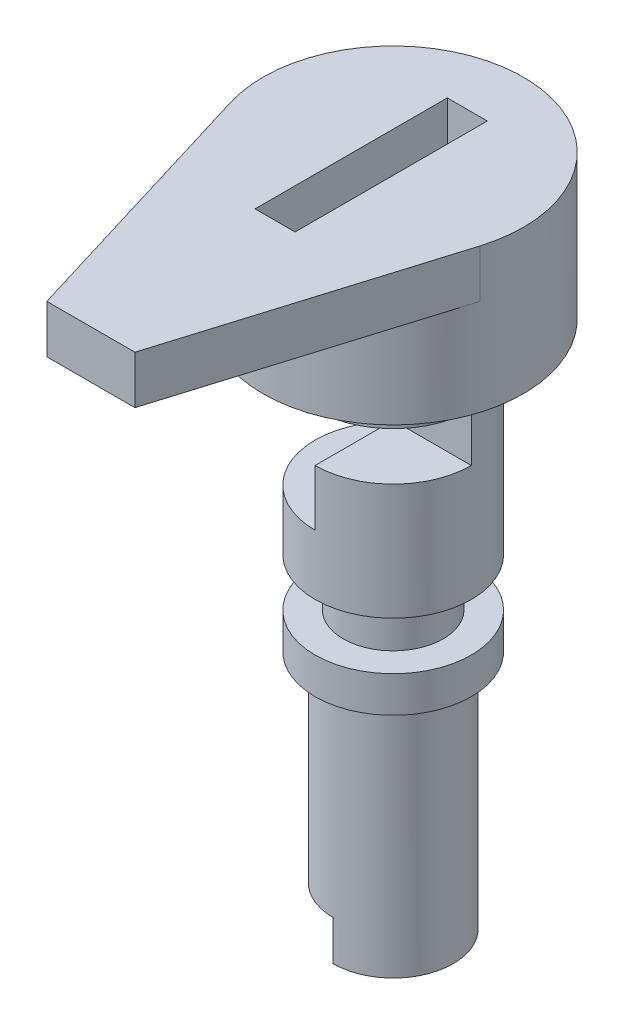
ISO-10303-21;
HEADER;
FILE_DESCRIPTION(('STEP AP214'),'2;1');
FILE_NAME('part.step','',(''),(''),'','','');
FILE_SCHEMA(('AUTOMOTIVE_DESIGN { 1 0 10303 214 1 1 1 1 }'));
ENDSEC;
DATA;
#1=APPLICATION_CONTEXT('core data for automotive mechanical design processes');
#2=APPLICATION_PROTOCOL_DEFINITION('international standard','automotive_design',2000,#1);
#3=PRODUCT_CONTEXT('',#1,'mechanical');
#4=PRODUCT('Part','Part','',(#3));
#5=PRODUCT_RELATED_PRODUCT_CATEGORY('part','',(#4));
#6=PRODUCT_DEFINITION_FORMATION('','',#4);
#7=PRODUCT_DEFINITION_CONTEXT('part definition',#1,'design');
#8=PRODUCT_DEFINITION('design','',#6,#7);
#9=PRODUCT_DEFINITION_SHAPE('','',#8);
#10=(LENGTH_UNIT() NAMED_UNIT(*) SI_UNIT(.MILLI.,.METRE.));
#11=(NAMED_UNIT(*) PLANE_ANGLE_UNIT() SI_UNIT($,.RADIAN.));
#12=(NAMED_UNIT(*) SI_UNIT($,.STERADIAN.) SOLID_ANGLE_UNIT());
#13=UNCERTAINTY_MEASURE_WITH_UNIT(LENGTH_MEASURE(1.E-05),#10,'distance_accuracy_value','');
#14=(GEOMETRIC_REPRESENTATION_CONTEXT(3) GLOBAL_UNCERTAINTY_ASSIGNED_CONTEXT((#13)) GLOBAL_UNIT_ASSIGNED_CONTEXT((#10,
#11,#12)) REPRESENTATION_CONTEXT('',''));
#15=CARTESIAN_POINT('',(0.,0.,0.));
#16=DIRECTION('',(0.,0.,1.));
#17=DIRECTION('',(1.,0.,0.));
#18=AXIS2_PLACEMENT_3D('',#15,#16,#17);
#19=CARTESIAN_POINT('',(0.,-13.2,0.));
#20=DIRECTION('',(0.,1.,0.));
#21=DIRECTION('',(0.,0.,1.));
#22=AXIS2_PLACEMENT_3D('',#19,#20,#21);
#23=CYLINDRICAL_SURFACE('',#22,1.5);
#24=CARTESIAN_POINT('',(0.,-7.2,0.));
#25=DIRECTION('',(0.,-1.,0.));
#26=DIRECTION('',(0.,0.,-1.));
#27=AXIS2_PLACEMENT_3D('',#24,#25,#26);
#28=CIRCLE('',#27,1.5);
#29=CARTESIAN_POINT('',(0.,-7.2,-1.5));
#30=VERTEX_POINT('',#29);
#31=EDGE_CURVE('E11',#30,#30,#28,.T.);
#32=ORIENTED_EDGE('',*,*,#31,.T.);
#33=EDGE_LOOP('',(#32));
#34=FACE_BOUND('',#33,.T.);
#35=DIRECTION('',(0.,-1.,0.));
#36=VECTOR('',#35,1.);
#37=CARTESIAN_POINT('',(0.,-12.2,-1.5));
#38=LINE('',#37,#36);
#39=CARTESIAN_POINT('',(0.,-12.2,-1.5));
#40=VERTEX_POINT('',#39);
#41=CARTESIAN_POINT('',(0.,-13.2,-1.5));
#42=VERTEX_POINT('',#41);
#43=EDGE_CURVE('E185',#40,#42,#38,.T.);
#44=ORIENTED_EDGE('',*,*,#43,.F.);
#45=CARTESIAN_POINT('',(0.,-12.2,0.));
#46=DIRECTION('',(0.,1.,0.));
#47=DIRECTION('',(0.,0.,1.));
#48=AXIS2_PLACEMENT_3D('',#45,#46,#47);
#49=CIRCLE('',#48,1.5);
#50=CARTESIAN_POINT('',(0.,-12.2,1.5));
#51=VERTEX_POINT('',#50);
#52=EDGE_CURVE('E192',#40,#51,#49,.T.);
#53=ORIENTED_EDGE('',*,*,#52,.T.);
#54=DIRECTION('',(0.,-1.,0.));
#55=VECTOR('',#54,1.);
#56=CARTESIAN_POINT('',(0.,-12.2,1.5));
#57=LINE('',#56,#55);
#58=CARTESIAN_POINT('',(0.,-13.2,1.5));
#59=VERTEX_POINT('',#58);
#60=EDGE_CURVE('E175',#51,#59,#57,.T.);
#61=ORIENTED_EDGE('',*,*,#60,.T.);
#62=CARTESIAN_POINT('',(0.,-13.2,0.));
#63=DIRECTION('',(0.,-1.,0.));
#64=DIRECTION('',(0.,0.,-1.));
#65=AXIS2_PLACEMENT_3D('',#62,#63,#64);
#66=CIRCLE('',#65,1.5);
#67=EDGE_CURVE('E225',#42,#59,#66,.T.);
#68=ORIENTED_EDGE('',*,*,#67,.F.);
#69=EDGE_LOOP('',(#44,#53,#61,#68));
#70=FACE_BOUND('',#69,.T.);
#71=ADVANCED_FACE('F32',(#34,#70),#23,.T.);
#72=CARTESIAN_POINT('',(0.,-13.2,0.));
#73=DIRECTION('',(0.,-1.,0.));
#74=DIRECTION('',(0.,0.,-1.));
#75=AXIS2_PLACEMENT_3D('',#72,#73,#74);
#76=PLANE('',#75);
#77=CARTESIAN_POINT('',(0.,-13.2,0.));
#78=DIRECTION('',(0.,1.,0.));
#79=DIRECTION('',(0.,0.,1.));
#80=AXIS2_PLACEMENT_3D('',#77,#78,#79);
#81=CIRCLE('',#80,0.01);
#82=CARTESIAN_POINT('',(0.,-13.2,-0.01));
#83=VERTEX_POINT('',#82);
#84=CARTESIAN_POINT('',(0.,-13.2,0.01));
#85=VERTEX_POINT('',#84);
#86=EDGE_CURVE('E195',#83,#85,#81,.T.);
#87=ORIENTED_EDGE('',*,*,#86,.F.);
#88=DIRECTION('',(0.,0.,1.));
#89=VECTOR('',#88,1.);
#90=CARTESIAN_POINT('',(0.,-13.2,-1.5));
#91=LINE('',#90,#89);
#92=EDGE_CURVE('E187',#42,#83,#91,.T.);
#93=ORIENTED_EDGE('',*,*,#92,.F.);
#94=ORIENTED_EDGE('',*,*,#67,.T.);
#95=DIRECTION('',(0.,0.,-1.));
#96=VECTOR('',#95,1.);
#97=CARTESIAN_POINT('',(0.,-13.2,1.5));
#98=LINE('',#97,#96);
#99=EDGE_CURVE('E181',#59,#85,#98,.T.);
#100=ORIENTED_EDGE('',*,*,#99,.T.);
#101=EDGE_LOOP('',(#87,#93,#94,#100));
#102=FACE_BOUND('',#101,.T.);
#103=ADVANCED_FACE('F310',(#102),#76,.T.);
#104=CARTESIAN_POINT('',(0.,2.4,0.));
#105=DIRECTION('',(0.,-1.,0.));
#106=DIRECTION('',(0.,0.,-1.));
#107=AXIS2_PLACEMENT_3D('',#104,#105,#106);
#108=CYLINDRICAL_SURFACE('',#107,3.25);
#109=CARTESIAN_POINT('',(0.,2.4,0.));
#110=DIRECTION('',(0.,1.,0.));
#111=DIRECTION('',(0.,0.,1.));
#112=AXIS2_PLACEMENT_3D('',#109,#110,#111);
#113=CIRCLE('',#112,3.25);
#114=CARTESIAN_POINT('',(-3.10927392322903,2.4,0.94599982575471));
#115=VERTEX_POINT('',#114);
#116=CARTESIAN_POINT('',(3.10927392322903,2.4,0.94599982575471));
#117=VERTEX_POINT('',#116);
#118=EDGE_CURVE('E266',#115,#117,#113,.T.);
#119=ORIENTED_EDGE('',*,*,#118,.F.);
#120=DIRECTION('',(0.,-1.,0.));
#121=VECTOR('',#120,1.);
#122=CARTESIAN_POINT('',(-3.10927392322903,3.6,0.94599982575471));
#123=LINE('',#122,#121);
#124=CARTESIAN_POINT('',(-3.10927392322903,3.6,0.94599982575471));
#125=VERTEX_POINT('',#124);
#126=EDGE_CURVE('E222',#125,#115,#123,.T.);
#127=ORIENTED_EDGE('',*,*,#126,.F.);
#128=CARTESIAN_POINT('',(0.,3.6,0.));
#129=DIRECTION('',(0.,1.,0.));
#130=DIRECTION('',(0.,0.,1.));
#131=AXIS2_PLACEMENT_3D('',#128,#129,#130);
#132=CIRCLE('',#131,3.25);
#133=CARTESIAN_POINT('',(3.10927392322903,3.6,0.94599982575471));
#134=VERTEX_POINT('',#133);
#135=EDGE_CURVE('E198',#134,#125,#132,.T.);
#136=ORIENTED_EDGE('',*,*,#135,.F.);
#137=DIRECTION('',(0.,-1.,0.));
#138=VECTOR('',#137,1.);
#139=CARTESIAN_POINT('',(3.10927392322903,3.6,0.94599982575471));
#140=LINE('',#139,#138);
#141=EDGE_CURVE('E208',#134,#117,#140,.T.);
#142=ORIENTED_EDGE('',*,*,#141,.T.);
#143=EDGE_LOOP('',(#119,#127,#136,#142));
#144=FACE_BOUND('',#143,.T.);
#145=CARTESIAN_POINT('',(0.,0.,0.));
#146=DIRECTION('',(0.,1.,0.));
#147=DIRECTION('',(0.,0.,1.));
#148=AXIS2_PLACEMENT_3D('',#145,#146,#147);
#149=CIRCLE('',#148,3.25);
#150=CARTESIAN_POINT('',(0.,0.,3.25));
#151=VERTEX_POINT('',#150);
#152=EDGE_CURVE('E261',#151,#151,#149,.T.);
#153=ORIENTED_EDGE('',*,*,#152,.T.);
#154=EDGE_LOOP('',(#153));
#155=FACE_BOUND('',#154,.T.);
#156=ADVANCED_FACE('F34',(#144,#155),#108,.T.);
#157=CARTESIAN_POINT('',(0.,0.,0.));
#158=DIRECTION('',(0.,1.,0.));
#159=DIRECTION('',(0.,0.,1.));
#160=AXIS2_PLACEMENT_3D('',#157,#158,#159);
#161=PLANE('',#160);
#162=CARTESIAN_POINT('',(0.,0.,0.));
#163=DIRECTION('',(0.,-1.,0.));
#164=DIRECTION('',(0.,0.,-1.));
#165=AXIS2_PLACEMENT_3D('',#162,#163,#164);
#166=CIRCLE('',#165,1.95);
#167=CARTESIAN_POINT('',(0.,0.,-1.95));
#168=VERTEX_POINT('',#167);
#169=EDGE_CURVE('E262',#168,#168,#166,.T.);
#170=ORIENTED_EDGE('',*,*,#169,.F.);
#171=EDGE_LOOP('',(#170));
#172=FACE_BOUND('',#171,.T.);
#173=ORIENTED_EDGE('',*,*,#152,.F.);
#174=EDGE_LOOP('',(#173));
#175=FACE_BOUND('',#174,.T.);
#176=ADVANCED_FACE('F340',(#172,#175),#161,.F.);
#177=CARTESIAN_POINT('',(0.,-7.2,0.));
#178=DIRECTION('',(0.,1.,0.));
#179=DIRECTION('',(0.,0.,1.));
#180=AXIS2_PLACEMENT_3D('',#177,#178,#179);
#181=CYLINDRICAL_SURFACE('',#180,1.95);
#182=CARTESIAN_POINT('',(0.,-5.1,0.));
#183=DIRECTION('',(0.,1.,0.));
#184=DIRECTION('',(0.,0.,1.));
#185=AXIS2_PLACEMENT_3D('',#182,#183,#184);
#186=CIRCLE('',#185,1.95);
#187=CARTESIAN_POINT('',(0.,-5.1,1.95));
#188=VERTEX_POINT('',#187);
#189=EDGE_CURVE('E227',#188,#188,#186,.T.);
#190=ORIENTED_EDGE('',*,*,#189,.T.);
#191=EDGE_LOOP('',(#190));
#192=FACE_BOUND('',#191,.T.);
#193=CARTESIAN_POINT('',(0.,-1.,0.));
#194=DIRECTION('',(0.,1.,0.));
#195=DIRECTION('',(-1.,0.,0.));
#196=AXIS2_PLACEMENT_3D('',#193,#194,#195);
#197=CIRCLE('',#196,1.95);
#198=CARTESIAN_POINT('',(0.,-1.,-1.95));
#199=VERTEX_POINT('',#198);
#200=CARTESIAN_POINT('',(1.95,-1.,0.));
#201=VERTEX_POINT('',#200);
#202=EDGE_CURVE('E277',#199,#201,#197,.T.);
#203=ORIENTED_EDGE('',*,*,#202,.T.);
#204=DIRECTION('',(0.,1.,0.));
#205=VECTOR('',#204,1.);
#206=CARTESIAN_POINT('',(1.95,-7.2,0.));
#207=LINE('',#206,#205);
#208=CARTESIAN_POINT('',(1.95,-2.2,0.));
#209=VERTEX_POINT('',#208);
#210=EDGE_CURVE('E249',#201,#209,#207,.F.);
#211=ORIENTED_EDGE('',*,*,#210,.T.);
#212=CARTESIAN_POINT('',(0.,-2.2,0.));
#213=DIRECTION('',(0.,-1.,0.));
#214=DIRECTION('',(0.,0.,-1.));
#215=AXIS2_PLACEMENT_3D('',#212,#213,#214);
#216=CIRCLE('',#215,1.95);
#217=CARTESIAN_POINT('',(0.,-2.2,1.95));
#218=VERTEX_POINT('',#217);
#219=EDGE_CURVE('E244',#209,#218,#216,.T.);
#220=ORIENTED_EDGE('',*,*,#219,.T.);
#221=DIRECTION('',(0.,1.,0.));
#222=VECTOR('',#221,1.);
#223=CARTESIAN_POINT('',(0.,-7.2,1.95));
#224=LINE('',#223,#222);
#225=CARTESIAN_POINT('',(0.,-3.6,1.95));
#226=VERTEX_POINT('',#225);
#227=EDGE_CURVE('E272',#218,#226,#224,.F.);
#228=ORIENTED_EDGE('',*,*,#227,.T.);
#229=CARTESIAN_POINT('',(0.,-3.6,0.));
#230=DIRECTION('',(0.,-1.,0.));
#231=DIRECTION('',(0.,0.,-1.));
#232=AXIS2_PLACEMENT_3D('',#229,#230,#231);
#233=CIRCLE('',#232,1.95);
#234=CARTESIAN_POINT('',(0.,-3.6,-1.95));
#235=VERTEX_POINT('',#234);
#236=EDGE_CURVE('E265',#226,#235,#233,.T.);
#237=ORIENTED_EDGE('',*,*,#236,.T.);
#238=DIRECTION('',(0.,1.,0.));
#239=VECTOR('',#238,1.);
#240=CARTESIAN_POINT('',(0.,-7.2,-1.95));
#241=LINE('',#240,#239);
#242=EDGE_CURVE('E274',#235,#199,#241,.T.);
#243=ORIENTED_EDGE('',*,*,#242,.T.);
#244=EDGE_LOOP('',(#203,#211,#220,#228,#237,#243));
#245=FACE_BOUND('',#244,.T.);
#246=ORIENTED_EDGE('',*,*,#169,.T.);
#247=EDGE_LOOP('',(#246));
#248=FACE_BOUND('',#247,.T.);
#249=ADVANCED_FACE('F292',(#192,#245,#248),#181,.T.);
#250=CARTESIAN_POINT('',(0.,-1.,-3.25));
#251=DIRECTION('',(0.,1.,0.));
#252=DIRECTION('',(-1.,0.,0.));
#253=AXIS2_PLACEMENT_3D('',#250,#251,#252);
#254=PLANE('',#253);
#255=DIRECTION('',(0.,0.,1.));
#256=VECTOR('',#255,1.);
#257=CARTESIAN_POINT('',(0.,-1.,-3.25));
#258=LINE('',#257,#256);
#259=CARTESIAN_POINT('',(0.,-1.,0.));
#260=VERTEX_POINT('',#259);
#261=EDGE_CURVE('E253',#199,#260,#258,.T.);
#262=ORIENTED_EDGE('',*,*,#261,.T.);
#263=DIRECTION('',(1.,0.,0.));
#264=VECTOR('',#263,1.);
#265=CARTESIAN_POINT('',(-3.25,-1.,0.));
#266=LINE('',#265,#264);
#267=EDGE_CURVE('E241',#260,#201,#266,.T.);
#268=ORIENTED_EDGE('',*,*,#267,.T.);
#269=ORIENTED_EDGE('',*,*,#202,.F.);
#270=EDGE_LOOP('',(#262,#268,#269));
#271=FACE_BOUND('',#270,.T.);
#272=ADVANCED_FACE('F289',(#271),#254,.F.);
#273=CARTESIAN_POINT('',(0.,-3.6,-3.25));
#274=DIRECTION('',(1.,0.,0.));
#275=DIRECTION('',(0.,1.,0.));
#276=AXIS2_PLACEMENT_3D('',#273,#274,#275);
#277=PLANE('',#276);
#278=DIRECTION('',(0.,0.,-1.));
#279=VECTOR('',#278,1.);
#280=CARTESIAN_POINT('',(0.,-2.2,-3.25));
#281=LINE('',#280,#279);
#282=CARTESIAN_POINT('',(0.,-2.2,0.));
#283=VERTEX_POINT('',#282);
#284=EDGE_CURVE('E278',#218,#283,#281,.T.);
#285=ORIENTED_EDGE('',*,*,#284,.T.);
#286=DIRECTION('',(0.,1.,0.));
#287=VECTOR('',#286,1.);
#288=CARTESIAN_POINT('',(0.,-3.6,0.));
#289=LINE('',#288,#287);
#290=EDGE_CURVE('E36',#283,#260,#289,.T.);
#291=ORIENTED_EDGE('',*,*,#290,.T.);
#292=ORIENTED_EDGE('',*,*,#261,.F.);
#293=ORIENTED_EDGE('',*,*,#242,.F.);
#294=DIRECTION('',(0.,0.,1.));
#295=VECTOR('',#294,1.);
#296=CARTESIAN_POINT('',(0.,-3.6,-3.25));
#297=LINE('',#296,#295);
#298=EDGE_CURVE('E252',#235,#226,#297,.T.);
#299=ORIENTED_EDGE('',*,*,#298,.T.);
#300=ORIENTED_EDGE('',*,*,#227,.F.);
#301=EDGE_LOOP('',(#285,#291,#292,#293,#299,#300));
#302=FACE_BOUND('',#301,.T.);
#303=ADVANCED_FACE('F285',(#302),#277,.F.);
#304=CARTESIAN_POINT('',(0.,-3.6,-3.25));
#305=DIRECTION('',(0.,-1.,0.));
#306=DIRECTION('',(0.,0.,-1.));
#307=AXIS2_PLACEMENT_3D('',#304,#305,#306);
#308=PLANE('',#307);
#309=ORIENTED_EDGE('',*,*,#298,.F.);
#310=ORIENTED_EDGE('',*,*,#236,.F.);
#311=EDGE_LOOP('',(#309,#310));
#312=FACE_BOUND('',#311,.T.);
#313=ADVANCED_FACE('F299',(#312),#308,.F.);
#314=CARTESIAN_POINT('',(-3.25,-2.2,0.));
#315=DIRECTION('',(0.,0.,-1.));
#316=DIRECTION('',(-1.,0.,0.));
#317=AXIS2_PLACEMENT_3D('',#314,#315,#316);
#318=PLANE('',#317);
#319=ORIENTED_EDGE('',*,*,#267,.F.);
#320=ORIENTED_EDGE('',*,*,#290,.F.);
#321=DIRECTION('',(1.,0.,0.));
#322=VECTOR('',#321,1.);
#323=CARTESIAN_POINT('',(-3.25,-2.2,0.));
#324=LINE('',#323,#322);
#325=EDGE_CURVE('E240',#283,#209,#324,.T.);
#326=ORIENTED_EDGE('',*,*,#325,.T.);
#327=ORIENTED_EDGE('',*,*,#210,.F.);
#328=EDGE_LOOP('',(#319,#320,#326,#327));
#329=FACE_BOUND('',#328,.T.);
#330=ADVANCED_FACE('F294',(#329),#318,.F.);
#331=CARTESIAN_POINT('',(-3.25,-2.2,0.));
#332=DIRECTION('',(0.,-1.,0.));
#333=DIRECTION('',(0.,0.,-1.));
#334=AXIS2_PLACEMENT_3D('',#331,#332,#333);
#335=PLANE('',#334);
#336=ORIENTED_EDGE('',*,*,#325,.F.);
#337=ORIENTED_EDGE('',*,*,#284,.F.);
#338=ORIENTED_EDGE('',*,*,#219,.F.);
#339=EDGE_LOOP('',(#336,#337,#338));
#340=FACE_BOUND('',#339,.T.);
#341=ADVANCED_FACE('F296',(#340),#335,.F.);
#342=CARTESIAN_POINT('',(-1.95,-6.3,0.));
#343=DIRECTION('',(0.,-1.,0.));
#344=DIRECTION('',(0.,0.,-1.));
#345=AXIS2_PLACEMENT_3D('',#342,#343,#344);
#346=PLANE('',#345);
#347=CARTESIAN_POINT('',(0.,-6.3,0.));
#348=DIRECTION('',(0.,1.,0.));
#349=DIRECTION('',(0.,0.,1.));
#350=AXIS2_PLACEMENT_3D('',#347,#348,#349);
#351=CIRCLE('',#350,1.25);
#352=CARTESIAN_POINT('',(0.,-6.3,1.25));
#353=VERTEX_POINT('',#352);
#354=EDGE_CURVE('E234',#353,#353,#351,.T.);
#355=ORIENTED_EDGE('',*,*,#354,.F.);
#356=EDGE_LOOP('',(#355));
#357=FACE_BOUND('',#356,.T.);
#358=CARTESIAN_POINT('',(0.,-6.3,0.));
#359=DIRECTION('',(0.,1.,0.));
#360=DIRECTION('',(0.,0.,1.));
#361=AXIS2_PLACEMENT_3D('',#358,#359,#360);
#362=CIRCLE('',#361,1.95);
#363=CARTESIAN_POINT('',(0.,-6.3,1.95));
#364=VERTEX_POINT('',#363);
#365=EDGE_CURVE('E237',#364,#364,#362,.T.);
#366=ORIENTED_EDGE('',*,*,#365,.T.);
#367=EDGE_LOOP('',(#366));
#368=FACE_BOUND('',#367,.T.);
#369=ADVANCED_FACE('F329',(#357,#368),#346,.F.);
#370=CARTESIAN_POINT('',(0.,0.,0.));
#371=DIRECTION('',(0.,1.,0.));
#372=DIRECTION('',(0.,0.,1.));
#373=AXIS2_PLACEMENT_3D('',#370,#371,#372);
#374=CYLINDRICAL_SURFACE('',#373,1.25);
#375=CARTESIAN_POINT('',(0.,-5.1,0.));
#376=DIRECTION('',(0.,1.,0.));
#377=DIRECTION('',(0.,0.,1.));
#378=AXIS2_PLACEMENT_3D('',#375,#376,#377);
#379=CIRCLE('',#378,1.25);
#380=CARTESIAN_POINT('',(0.,-5.1,1.25));
#381=VERTEX_POINT('',#380);
#382=EDGE_CURVE('E231',#381,#381,#379,.T.);
#383=ORIENTED_EDGE('',*,*,#382,.F.);
#384=EDGE_LOOP('',(#383));
#385=FACE_BOUND('',#384,.T.);
#386=ORIENTED_EDGE('',*,*,#354,.T.);
#387=EDGE_LOOP('',(#386));
#388=FACE_BOUND('',#387,.T.);
#389=ADVANCED_FACE('F325',(#385,#388),#374,.T.);
#390=CARTESIAN_POINT('',(-1.95,-5.1,0.));
#391=DIRECTION('',(0.,1.,0.));
#392=DIRECTION('',(0.,0.,1.));
#393=AXIS2_PLACEMENT_3D('',#390,#391,#392);
#394=PLANE('',#393);
#395=ORIENTED_EDGE('',*,*,#189,.F.);
#396=EDGE_LOOP('',(#395));
#397=FACE_BOUND('',#396,.T.);
#398=ORIENTED_EDGE('',*,*,#382,.T.);
#399=EDGE_LOOP('',(#398));
#400=FACE_BOUND('',#399,.T.);
#401=ADVANCED_FACE('F321',(#397,#400),#394,.F.);
#402=CARTESIAN_POINT('',(0.,-7.2,0.));
#403=DIRECTION('',(0.,-1.,0.));
#404=DIRECTION('',(0.,0.,-1.));
#405=AXIS2_PLACEMENT_3D('',#402,#403,#404);
#406=PLANE('',#405);
#407=ORIENTED_EDGE('',*,*,#31,.F.);
#408=EDGE_LOOP('',(#407));
#409=FACE_BOUND('',#408,.T.);
#410=CARTESIAN_POINT('',(0.,-7.2,0.));
#411=DIRECTION('',(0.,-1.,0.));
#412=DIRECTION('',(0.,0.,-1.));
#413=AXIS2_PLACEMENT_3D('',#410,#411,#412);
#414=CIRCLE('',#413,1.95);
#415=CARTESIAN_POINT('',(0.,-7.2,-1.95));
#416=VERTEX_POINT('',#415);
#417=EDGE_CURVE('E256',#416,#416,#414,.T.);
#418=ORIENTED_EDGE('',*,*,#417,.T.);
#419=EDGE_LOOP('',(#418));
#420=FACE_BOUND('',#419,.T.);
#421=ADVANCED_FACE('F324',(#409,#420),#406,.T.);
#422=ORIENTED_EDGE('',*,*,#365,.F.);
#423=EDGE_LOOP('',(#422));
#424=FACE_BOUND('',#423,.T.);
#425=ORIENTED_EDGE('',*,*,#417,.F.);
#426=EDGE_LOOP('',(#425));
#427=FACE_BOUND('',#426,.T.);
#428=ADVANCED_FACE('F343',(#424,#427),#181,.T.);
#429=CARTESIAN_POINT('',(0.,2.4,0.));
#430=DIRECTION('',(0.,1.,0.));
#431=DIRECTION('',(0.,0.,1.));
#432=AXIS2_PLACEMENT_3D('',#429,#430,#431);
#433=PLANE('',#432);
#434=DIRECTION('',(0.291076869462988,0.,0.956699668685856));
#435=VECTOR('',#434,1.);
#436=CARTESIAN_POINT('',(-3.10927392322903,2.4,0.94599982575471));
#437=LINE('',#436,#435);
#438=CARTESIAN_POINT('',(-1.1,2.4,7.55));
#439=VERTEX_POINT('',#438);
#440=EDGE_CURVE('E197',#115,#439,#437,.T.);
#441=ORIENTED_EDGE('',*,*,#440,.F.);
#442=ORIENTED_EDGE('',*,*,#118,.T.);
#443=DIRECTION('',(0.291076869462988,0.,-0.956699668685856));
#444=VECTOR('',#443,1.);
#445=CARTESIAN_POINT('',(1.1,2.4,7.55));
#446=LINE('',#445,#444);
#447=CARTESIAN_POINT('',(1.1,2.4,7.55));
#448=VERTEX_POINT('',#447);
#449=EDGE_CURVE('E202',#448,#117,#446,.T.);
#450=ORIENTED_EDGE('',*,*,#449,.F.);
#451=DIRECTION('',(1.,0.,0.));
#452=VECTOR('',#451,1.);
#453=CARTESIAN_POINT('',(-1.1,2.4,7.55));
#454=LINE('',#453,#452);
#455=EDGE_CURVE('E210',#439,#448,#454,.T.);
#456=ORIENTED_EDGE('',*,*,#455,.F.);
#457=EDGE_LOOP('',(#441,#442,#450,#456));
#458=FACE_BOUND('',#457,.T.);
#459=ADVANCED_FACE('F349',(#458),#433,.F.);
#460=CARTESIAN_POINT('',(-3.10927392322903,3.6,0.94599982575471));
#461=DIRECTION('',(0.956699668685856,0.,-0.291076869462988));
#462=DIRECTION('',(-0.291076869462988,0.,-0.956699668685856));
#463=AXIS2_PLACEMENT_3D('',#460,#461,#462);
#464=PLANE('',#463);
#465=ORIENTED_EDGE('',*,*,#440,.T.);
#466=DIRECTION('',(0.,-1.,0.));
#467=VECTOR('',#466,1.);
#468=CARTESIAN_POINT('',(-1.1,3.6,7.55));
#469=LINE('',#468,#467);
#470=CARTESIAN_POINT('',(-1.1,3.6,7.55));
#471=VERTEX_POINT('',#470);
#472=EDGE_CURVE('E219',#471,#439,#469,.T.);
#473=ORIENTED_EDGE('',*,*,#472,.F.);
#474=DIRECTION('',(0.291076869462988,0.,0.956699668685856));
#475=VECTOR('',#474,1.);
#476=CARTESIAN_POINT('',(-3.10927392322903,3.6,0.94599982575471));
#477=LINE('',#476,#475);
#478=EDGE_CURVE('E201',#125,#471,#477,.T.);
#479=ORIENTED_EDGE('',*,*,#478,.F.);
#480=ORIENTED_EDGE('',*,*,#126,.T.);
#481=EDGE_LOOP('',(#465,#473,#479,#480));
#482=FACE_BOUND('',#481,.T.);
#483=ADVANCED_FACE('F355',(#482),#464,.F.);
#484=CARTESIAN_POINT('',(-1.1,3.6,7.55));
#485=DIRECTION('',(0.,0.,-1.));
#486=DIRECTION('',(-1.,0.,0.));
#487=AXIS2_PLACEMENT_3D('',#484,#485,#486);
#488=PLANE('',#487);
#489=ORIENTED_EDGE('',*,*,#455,.T.);
#490=DIRECTION('',(0.,-1.,0.));
#491=VECTOR('',#490,1.);
#492=CARTESIAN_POINT('',(1.1,3.6,7.55));
#493=LINE('',#492,#491);
#494=CARTESIAN_POINT('',(1.1,3.6,7.55));
#495=VERTEX_POINT('',#494);
#496=EDGE_CURVE('E216',#495,#448,#493,.T.);
#497=ORIENTED_EDGE('',*,*,#496,.F.);
#498=DIRECTION('',(1.,0.,0.));
#499=VECTOR('',#498,1.);
#500=CARTESIAN_POINT('',(-1.1,3.6,7.55));
#501=LINE('',#500,#499);
#502=EDGE_CURVE('E204',#471,#495,#501,.T.);
#503=ORIENTED_EDGE('',*,*,#502,.F.);
#504=ORIENTED_EDGE('',*,*,#472,.T.);
#505=EDGE_LOOP('',(#489,#497,#503,#504));
#506=FACE_BOUND('',#505,.T.);
#507=ADVANCED_FACE('F518',(#506),#488,.F.);
#508=CARTESIAN_POINT('',(1.1,3.6,7.55));
#509=DIRECTION('',(-0.956699668685856,0.,-0.291076869462988));
#510=DIRECTION('',(-0.291076869462988,0.,0.956699668685856));
#511=AXIS2_PLACEMENT_3D('',#508,#509,#510);
#512=PLANE('',#511);
#513=ORIENTED_EDGE('',*,*,#449,.T.);
#514=ORIENTED_EDGE('',*,*,#141,.F.);
#515=DIRECTION('',(0.291076869462988,0.,-0.956699668685856));
#516=VECTOR('',#515,1.);
#517=CARTESIAN_POINT('',(1.1,3.6,7.55));
#518=LINE('',#517,#516);
#519=EDGE_CURVE('E206',#495,#134,#518,.T.);
#520=ORIENTED_EDGE('',*,*,#519,.F.);
#521=ORIENTED_EDGE('',*,*,#496,.T.);
#522=EDGE_LOOP('',(#513,#514,#520,#521));
#523=FACE_BOUND('',#522,.T.);
#524=ADVANCED_FACE('F467',(#523),#512,.F.);
#525=CARTESIAN_POINT('',(0.,3.6,0.));
#526=DIRECTION('',(0.,1.,0.));
#527=DIRECTION('',(0.,0.,1.));
#528=AXIS2_PLACEMENT_3D('',#525,#526,#527);
#529=PLANE('',#528);
#530=DIRECTION('',(0.,0.,-1.));
#531=VECTOR('',#530,1.);
#532=CARTESIAN_POINT('',(0.5,3.6,-1.85));
#533=LINE('',#532,#531);
#534=CARTESIAN_POINT('',(0.500000000000001,3.6,2.95));
#535=VERTEX_POINT('',#534);
#536=CARTESIAN_POINT('',(0.5,3.6,-1.85));
#537=VERTEX_POINT('',#536);
#538=EDGE_CURVE('E48',#535,#537,#533,.T.);
#539=ORIENTED_EDGE('',*,*,#538,.F.);
#540=DIRECTION('',(1.,0.,0.));
#541=VECTOR('',#540,1.);
#542=CARTESIAN_POINT('',(-0.500000000000001,3.6,2.95));
#543=LINE('',#542,#541);
#544=CARTESIAN_POINT('',(-0.500000000000001,3.6,2.95));
#545=VERTEX_POINT('',#544);
#546=EDGE_CURVE('E160',#545,#535,#543,.T.);
#547=ORIENTED_EDGE('',*,*,#546,.F.);
#548=DIRECTION('',(0.,0.,1.));
#549=VECTOR('',#548,1.);
#550=CARTESIAN_POINT('',(-0.5,3.6,-1.85));
#551=LINE('',#550,#549);
#552=CARTESIAN_POINT('',(-0.5,3.6,-1.85));
#553=VERTEX_POINT('',#552);
#554=EDGE_CURVE('E163',#553,#545,#551,.T.);
#555=ORIENTED_EDGE('',*,*,#554,.F.);
#556=DIRECTION('',(-1.,0.,0.));
#557=VECTOR('',#556,1.);
#558=CARTESIAN_POINT('',(-0.5,3.6,-1.85));
#559=LINE('',#558,#557);
#560=EDGE_CURVE('E169',#537,#553,#559,.T.);
#561=ORIENTED_EDGE('',*,*,#560,.F.);
#562=EDGE_LOOP('',(#539,#547,#555,#561));
#563=FACE_BOUND('',#562,.T.);
#564=ORIENTED_EDGE('',*,*,#135,.T.);
#565=ORIENTED_EDGE('',*,*,#478,.T.);
#566=ORIENTED_EDGE('',*,*,#502,.T.);
#567=ORIENTED_EDGE('',*,*,#519,.T.);
#568=EDGE_LOOP('',(#564,#565,#566,#567));
#569=FACE_BOUND('',#568,.T.);
#570=ADVANCED_FACE('F438',(#563,#569),#529,.T.);
#571=CARTESIAN_POINT('',(0.,-13.2,0.));
#572=DIRECTION('',(0.,1.,0.));
#573=DIRECTION('',(0.,0.,1.));
#574=AXIS2_PLACEMENT_3D('',#571,#572,#573);
#575=CONICAL_SURFACE('',#574,0.01,0.979702542984991);
#576=DIRECTION('',(0.,0.557269559388509,-0.830331643488876));
#577=VECTOR('',#576,1.);
#578=CARTESIAN_POINT('',(0.,-13.2,-0.01));
#579=LINE('',#578,#577);
#580=EDGE_CURVE('E189',#83,#40,#579,.T.);
#581=ORIENTED_EDGE('',*,*,#580,.F.);
#582=ORIENTED_EDGE('',*,*,#86,.T.);
#583=DIRECTION('',(0.,0.557269559388509,0.830331643488876));
#584=VECTOR('',#583,1.);
#585=CARTESIAN_POINT('',(0.,-13.2,0.01));
#586=LINE('',#585,#584);
#587=EDGE_CURVE('E56',#85,#51,#586,.T.);
#588=ORIENTED_EDGE('',*,*,#587,.T.);
#589=ORIENTED_EDGE('',*,*,#52,.F.);
#590=EDGE_LOOP('',(#581,#582,#588,#589));
#591=FACE_BOUND('',#590,.T.);
#592=ADVANCED_FACE('F432',(#591),#575,.T.);
#593=CARTESIAN_POINT('',(0.,0.,0.));
#594=DIRECTION('',(-1.,0.,0.));
#595=DIRECTION('',(0.,0.,1.));
#596=AXIS2_PLACEMENT_3D('',#593,#594,#595);
#597=PLANE('',#596);
#598=ORIENTED_EDGE('',*,*,#43,.T.);
#599=ORIENTED_EDGE('',*,*,#92,.T.);
#600=ORIENTED_EDGE('',*,*,#580,.T.);
#601=EDGE_LOOP('',(#598,#599,#600));
#602=FACE_BOUND('',#601,.T.);
#603=ADVANCED_FACE('F437',(#602),#597,.T.);
#604=CARTESIAN_POINT('',(0.,0.,0.));
#605=DIRECTION('',(1.,0.,0.));
#606=DIRECTION('',(0.,0.,-1.));
#607=AXIS2_PLACEMENT_3D('',#604,#605,#606);
#608=PLANE('',#607);
#609=ORIENTED_EDGE('',*,*,#60,.F.);
#610=ORIENTED_EDGE('',*,*,#587,.F.);
#611=ORIENTED_EDGE('',*,*,#99,.F.);
#612=EDGE_LOOP('',(#609,#610,#611));
#613=FACE_BOUND('',#612,.T.);
#614=ADVANCED_FACE('F449',(#613),#608,.F.);
#615=CARTESIAN_POINT('',(0.5,2.6,-1.85));
#616=DIRECTION('',(1.,0.,0.));
#617=DIRECTION('',(0.,0.,-1.));
#618=AXIS2_PLACEMENT_3D('',#615,#616,#617);
#619=PLANE('',#618);
#620=ORIENTED_EDGE('',*,*,#538,.T.);
#621=DIRECTION('',(0.,1.,0.));
#622=VECTOR('',#621,1.);
#623=CARTESIAN_POINT('',(0.5,2.6,-1.85));
#624=LINE('',#623,#622);
#625=CARTESIAN_POINT('',(0.5,2.6,-1.85));
#626=VERTEX_POINT('',#625);
#627=EDGE_CURVE('E138',#626,#537,#624,.T.);
#628=ORIENTED_EDGE('',*,*,#627,.F.);
#629=DIRECTION('',(0.,0.,-1.));
#630=VECTOR('',#629,1.);
#631=CARTESIAN_POINT('',(0.5,2.6,-1.85));
#632=LINE('',#631,#630);
#633=CARTESIAN_POINT('',(0.500000000000001,2.6,2.95));
#634=VERTEX_POINT('',#633);
#635=EDGE_CURVE('E142',#634,#626,#632,.T.);
#636=ORIENTED_EDGE('',*,*,#635,.F.);
#637=DIRECTION('',(0.,1.,0.));
#638=VECTOR('',#637,1.);
#639=CARTESIAN_POINT('',(0.500000000000001,2.6,2.95));
#640=LINE('',#639,#638);
#641=EDGE_CURVE('E173',#634,#535,#640,.T.);
#642=ORIENTED_EDGE('',*,*,#641,.T.);
#643=EDGE_LOOP('',(#620,#628,#636,#642));
#644=FACE_BOUND('',#643,.T.);
#645=ADVANCED_FACE('F140',(#644),#619,.F.);
#646=CARTESIAN_POINT('',(-0.500000000000001,2.6,2.95));
#647=DIRECTION('',(0.,0.,1.));
#648=DIRECTION('',(1.,0.,0.));
#649=AXIS2_PLACEMENT_3D('',#646,#647,#648);
#650=PLANE('',#649);
#651=ORIENTED_EDGE('',*,*,#546,.T.);
#652=ORIENTED_EDGE('',*,*,#641,.F.);
#653=DIRECTION('',(1.,0.,0.));
#654=VECTOR('',#653,1.);
#655=CARTESIAN_POINT('',(-0.500000000000001,2.6,2.95));
#656=LINE('',#655,#654);
#657=CARTESIAN_POINT('',(-0.500000000000001,2.6,2.95));
#658=VERTEX_POINT('',#657);
#659=EDGE_CURVE('E148',#658,#634,#656,.T.);
#660=ORIENTED_EDGE('',*,*,#659,.F.);
#661=DIRECTION('',(0.,1.,0.));
#662=VECTOR('',#661,1.);
#663=CARTESIAN_POINT('',(-0.500000000000001,2.6,2.95));
#664=LINE('',#663,#662);
#665=EDGE_CURVE('E176',#658,#545,#664,.T.);
#666=ORIENTED_EDGE('',*,*,#665,.T.);
#667=EDGE_LOOP('',(#651,#652,#660,#666));
#668=FACE_BOUND('',#667,.T.);
#669=ADVANCED_FACE('F477',(#668),#650,.F.);
#670=CARTESIAN_POINT('',(-0.5,2.6,-1.85));
#671=DIRECTION('',(-1.,0.,0.));
#672=DIRECTION('',(0.,0.,1.));
#673=AXIS2_PLACEMENT_3D('',#670,#671,#672);
#674=PLANE('',#673);
#675=ORIENTED_EDGE('',*,*,#554,.T.);
#676=ORIENTED_EDGE('',*,*,#665,.F.);
#677=DIRECTION('',(0.,0.,1.));
#678=VECTOR('',#677,1.);
#679=CARTESIAN_POINT('',(-0.5,2.6,-1.85));
#680=LINE('',#679,#678);
#681=CARTESIAN_POINT('',(-0.5,2.6,-1.85));
#682=VERTEX_POINT('',#681);
#683=EDGE_CURVE('E156',#682,#658,#680,.T.);
#684=ORIENTED_EDGE('',*,*,#683,.F.);
#685=DIRECTION('',(0.,1.,0.));
#686=VECTOR('',#685,1.);
#687=CARTESIAN_POINT('',(-0.5,2.6,-1.85));
#688=LINE('',#687,#686);
#689=EDGE_CURVE('E147',#682,#553,#688,.T.);
#690=ORIENTED_EDGE('',*,*,#689,.T.);
#691=EDGE_LOOP('',(#675,#676,#684,#690));
#692=FACE_BOUND('',#691,.T.);
#693=ADVANCED_FACE('F486',(#692),#674,.F.);
#694=CARTESIAN_POINT('',(-0.5,2.6,-1.85));
#695=DIRECTION('',(0.,0.,-1.));
#696=DIRECTION('',(-1.,0.,0.));
#697=AXIS2_PLACEMENT_3D('',#694,#695,#696);
#698=PLANE('',#697);
#699=ORIENTED_EDGE('',*,*,#560,.T.);
#700=ORIENTED_EDGE('',*,*,#689,.F.);
#701=DIRECTION('',(-1.,0.,0.));
#702=VECTOR('',#701,1.);
#703=CARTESIAN_POINT('',(-0.5,2.6,-1.85));
#704=LINE('',#703,#702);
#705=EDGE_CURVE('E151',#626,#682,#704,.T.);
#706=ORIENTED_EDGE('',*,*,#705,.F.);
#707=ORIENTED_EDGE('',*,*,#627,.T.);
#708=EDGE_LOOP('',(#699,#700,#706,#707));
#709=FACE_BOUND('',#708,.T.);
#710=ADVANCED_FACE('F152',(#709),#698,.F.);
#711=CARTESIAN_POINT('',(0.,2.6,0.));
#712=DIRECTION('',(0.,1.,0.));
#713=DIRECTION('',(0.,0.,1.));
#714=AXIS2_PLACEMENT_3D('',#711,#712,#713);
#715=PLANE('',#714);
#716=ORIENTED_EDGE('',*,*,#635,.T.);
#717=ORIENTED_EDGE('',*,*,#705,.T.);
#718=ORIENTED_EDGE('',*,*,#683,.T.);
#719=ORIENTED_EDGE('',*,*,#659,.T.);
#720=EDGE_LOOP('',(#716,#717,#718,#719));
#721=FACE_BOUND('',#720,.T.);
#722=ADVANCED_FACE('F158',(#721),#715,.T.);
#723=CLOSED_SHELL('',(#71,#103,#156,#176,#249,#272,#303,#313,#330,#341,#369,#389,#401,#421,#428,
#459,#483,#507,#524,#570,#592,#603,#614,#645,#669,#693,#710,#722));
#724=MANIFOLD_SOLID_BREP('B2',#723);
#725=ADVANCED_BREP_SHAPE_REPRESENTATION('',(#18,#724),#14);
#726=SHAPE_DEFINITION_REPRESENTATION(#9,#725);
ENDSEC;
END-ISO-10303-21;
